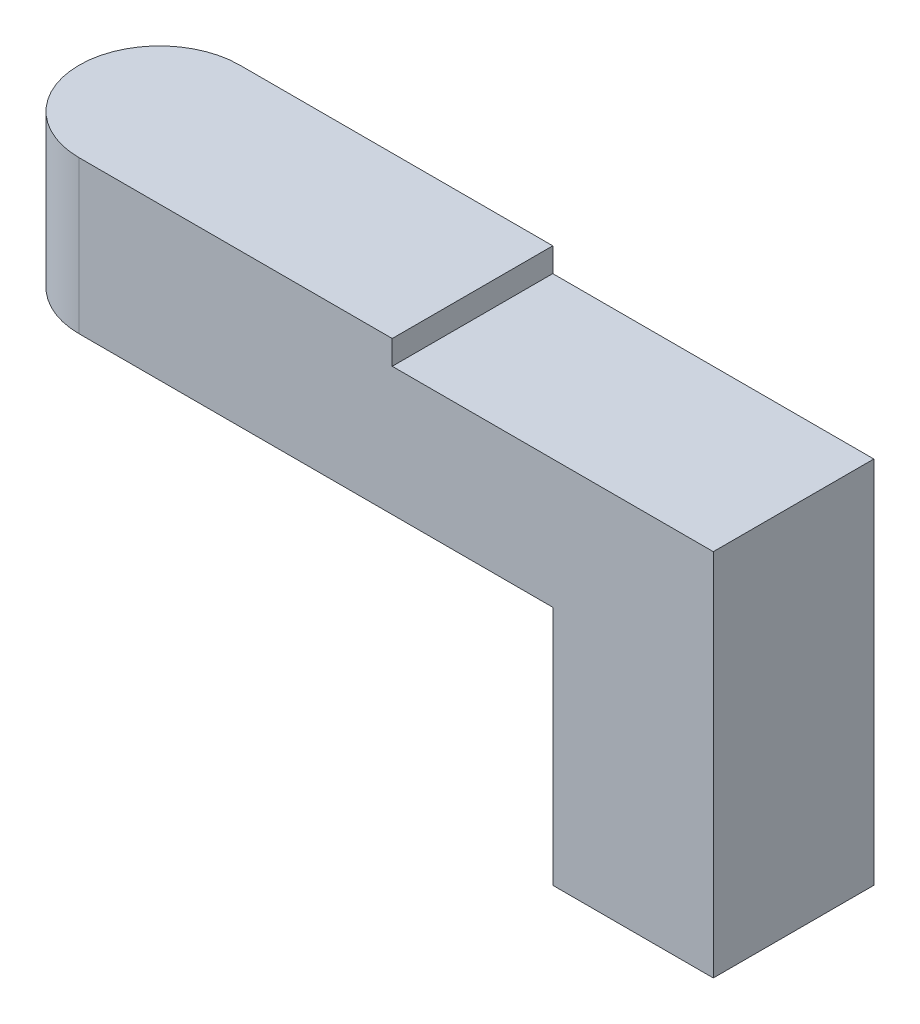
ISO-10303-21;
HEADER;
FILE_DESCRIPTION(('STEP AP214'),'2;1');
FILE_NAME('part.step','',(''),(''),'','','');
FILE_SCHEMA(('AUTOMOTIVE_DESIGN { 1 0 10303 214 1 1 1 1 }'));
ENDSEC;
DATA;
#1=APPLICATION_CONTEXT('core data for automotive mechanical design processes');
#2=APPLICATION_PROTOCOL_DEFINITION('international standard','automotive_design',2000,#1);
#3=PRODUCT_CONTEXT('',#1,'mechanical');
#4=PRODUCT('Part','Part','',(#3));
#5=PRODUCT_RELATED_PRODUCT_CATEGORY('part','',(#4));
#6=PRODUCT_DEFINITION_FORMATION('','',#4);
#7=PRODUCT_DEFINITION_CONTEXT('part definition',#1,'design');
#8=PRODUCT_DEFINITION('design','',#6,#7);
#9=PRODUCT_DEFINITION_SHAPE('','',#8);
#10=(LENGTH_UNIT() NAMED_UNIT(*) SI_UNIT(.MILLI.,.METRE.));
#11=(NAMED_UNIT(*) PLANE_ANGLE_UNIT() SI_UNIT($,.RADIAN.));
#12=(NAMED_UNIT(*) SI_UNIT($,.STERADIAN.) SOLID_ANGLE_UNIT());
#13=UNCERTAINTY_MEASURE_WITH_UNIT(LENGTH_MEASURE(1.E-05),#10,'distance_accuracy_value','');
#14=(GEOMETRIC_REPRESENTATION_CONTEXT(3) GLOBAL_UNCERTAINTY_ASSIGNED_CONTEXT((#13)) GLOBAL_UNIT_ASSIGNED_CONTEXT((#10,
#11,#12)) REPRESENTATION_CONTEXT('',''));
#15=CARTESIAN_POINT('',(0.,0.,0.));
#16=DIRECTION('',(0.,0.,1.));
#17=DIRECTION('',(1.,0.,0.));
#18=AXIS2_PLACEMENT_3D('',#15,#16,#17);
#19=CARTESIAN_POINT('',(34.5,10.,0.));
#20=DIRECTION('',(0.,0.,1.));
#21=DIRECTION('',(-1.,0.,0.));
#22=AXIS2_PLACEMENT_3D('',#19,#20,#21);
#23=PLANE('',#22);
#24=CARTESIAN_POINT('',(39.5,-10.,0.));
#25=DIRECTION('',(0.,0.,1.));
#26=DIRECTION('',(1.,0.,0.));
#27=AXIS2_PLACEMENT_3D('',#24,#25,#26);
#28=CIRCLE('',#27,2.);
#29=CARTESIAN_POINT('',(41.5,-10.,0.));
#30=VERTEX_POINT('',#29);
#31=EDGE_CURVE('E126',#30,#30,#28,.T.);
#32=ORIENTED_EDGE('',*,*,#31,.T.);
#33=EDGE_LOOP('',(#32));
#34=FACE_BOUND('',#33,.T.);
#35=CARTESIAN_POINT('',(39.5,3.,0.));
#36=DIRECTION('',(0.,0.,1.));
#37=DIRECTION('',(1.,0.,0.));
#38=AXIS2_PLACEMENT_3D('',#35,#36,#37);
#39=CIRCLE('',#38,2.);
#40=CARTESIAN_POINT('',(41.5,3.,0.));
#41=VERTEX_POINT('',#40);
#42=EDGE_CURVE('E133',#41,#41,#39,.T.);
#43=ORIENTED_EDGE('',*,*,#42,.T.);
#44=EDGE_LOOP('',(#43));
#45=FACE_BOUND('',#44,.T.);
#46=DIRECTION('',(1.,0.,0.));
#47=VECTOR('',#46,1.);
#48=CARTESIAN_POINT('',(5.,9.5,0.));
#49=LINE('',#48,#47);
#50=CARTESIAN_POINT('',(5.,9.5,0.));
#51=VERTEX_POINT('',#50);
#52=CARTESIAN_POINT('',(24.5,9.5,0.));
#53=VERTEX_POINT('',#52);
#54=EDGE_CURVE('E119',#51,#53,#49,.T.);
#55=ORIENTED_EDGE('',*,*,#54,.T.);
#56=DIRECTION('',(0.,1.,0.));
#57=VECTOR('',#56,1.);
#58=CARTESIAN_POINT('',(24.5,10.,0.));
#59=LINE('',#58,#57);
#60=CARTESIAN_POINT('',(24.5,8.,0.));
#61=VERTEX_POINT('',#60);
#62=EDGE_CURVE('E172',#61,#53,#59,.T.);
#63=ORIENTED_EDGE('',*,*,#62,.F.);
#64=DIRECTION('',(-1.,0.,0.));
#65=VECTOR('',#64,1.);
#66=CARTESIAN_POINT('',(34.5,8.,0.));
#67=LINE('',#66,#65);
#68=CARTESIAN_POINT('',(44.5,8.,0.));
#69=VERTEX_POINT('',#68);
#70=EDGE_CURVE('E174',#69,#61,#67,.T.);
#71=ORIENTED_EDGE('',*,*,#70,.F.);
#72=DIRECTION('',(0.,-1.,0.));
#73=VECTOR('',#72,1.);
#74=CARTESIAN_POINT('',(44.5,10.,0.));
#75=LINE('',#74,#73);
#76=CARTESIAN_POINT('',(44.5,-15.,0.));
#77=VERTEX_POINT('',#76);
#78=EDGE_CURVE('E184',#69,#77,#75,.T.);
#79=ORIENTED_EDGE('',*,*,#78,.T.);
#80=DIRECTION('',(-1.,0.,0.));
#81=VECTOR('',#80,1.);
#82=CARTESIAN_POINT('',(34.5,-15.,0.));
#83=LINE('',#82,#81);
#84=CARTESIAN_POINT('',(34.5,-15.,0.));
#85=VERTEX_POINT('',#84);
#86=EDGE_CURVE('E148',#77,#85,#83,.T.);
#87=ORIENTED_EDGE('',*,*,#86,.T.);
#88=DIRECTION('',(0.,1.,0.));
#89=VECTOR('',#88,1.);
#90=CARTESIAN_POINT('',(34.5,-15.,0.));
#91=LINE('',#90,#89);
#92=CARTESIAN_POINT('',(34.5,0.,0.));
#93=VERTEX_POINT('',#92);
#94=EDGE_CURVE('E151',#85,#93,#91,.T.);
#95=ORIENTED_EDGE('',*,*,#94,.T.);
#96=DIRECTION('',(1.,0.,0.));
#97=VECTOR('',#96,1.);
#98=CARTESIAN_POINT('',(34.5,0.,0.));
#99=LINE('',#98,#97);
#100=CARTESIAN_POINT('',(5.,0.,0.));
#101=VERTEX_POINT('',#100);
#102=EDGE_CURVE('E121',#101,#93,#99,.T.);
#103=ORIENTED_EDGE('',*,*,#102,.F.);
#104=DIRECTION('',(0.,-1.,0.));
#105=VECTOR('',#104,1.);
#106=CARTESIAN_POINT('',(5.,10.,0.));
#107=LINE('',#106,#105);
#108=EDGE_CURVE('E11',#51,#101,#107,.T.);
#109=ORIENTED_EDGE('',*,*,#108,.F.);
#110=EDGE_LOOP('',(#55,#63,#71,#79,#87,#95,#103,#109));
#111=FACE_BOUND('',#110,.T.);
#112=ADVANCED_FACE('F35',(#34,#45,#111),#23,.F.);
#113=CARTESIAN_POINT('',(0.,10.,10.));
#114=DIRECTION('',(0.,0.,-1.));
#115=DIRECTION('',(1.,0.,0.));
#116=AXIS2_PLACEMENT_3D('',#113,#114,#115);
#117=PLANE('',#116);
#118=DIRECTION('',(-1.,0.,0.));
#119=VECTOR('',#118,1.);
#120=CARTESIAN_POINT('',(24.5,9.5,10.));
#121=LINE('',#120,#119);
#122=CARTESIAN_POINT('',(24.5,9.5,10.));
#123=VERTEX_POINT('',#122);
#124=CARTESIAN_POINT('',(5.,9.5,10.));
#125=VERTEX_POINT('',#124);
#126=EDGE_CURVE('E114',#123,#125,#121,.T.);
#127=ORIENTED_EDGE('',*,*,#126,.T.);
#128=DIRECTION('',(0.,-1.,0.));
#129=VECTOR('',#128,1.);
#130=CARTESIAN_POINT('',(5.,10.,10.));
#131=LINE('',#130,#129);
#132=CARTESIAN_POINT('',(5.,0.,10.));
#133=VERTEX_POINT('',#132);
#134=EDGE_CURVE('E44',#133,#125,#131,.F.);
#135=ORIENTED_EDGE('',*,*,#134,.F.);
#136=DIRECTION('',(-1.,0.,0.));
#137=VECTOR('',#136,1.);
#138=CARTESIAN_POINT('',(0.,0.,10.));
#139=LINE('',#138,#137);
#140=CARTESIAN_POINT('',(34.5,0.,10.));
#141=VERTEX_POINT('',#140);
#142=EDGE_CURVE('E178',#141,#133,#139,.T.);
#143=ORIENTED_EDGE('',*,*,#142,.F.);
#144=DIRECTION('',(0.,1.,0.));
#145=VECTOR('',#144,1.);
#146=CARTESIAN_POINT('',(34.5,-15.,10.));
#147=LINE('',#146,#145);
#148=CARTESIAN_POINT('',(34.5,-15.,10.));
#149=VERTEX_POINT('',#148);
#150=EDGE_CURVE('E154',#149,#141,#147,.T.);
#151=ORIENTED_EDGE('',*,*,#150,.F.);
#152=DIRECTION('',(1.,0.,0.));
#153=VECTOR('',#152,1.);
#154=CARTESIAN_POINT('',(34.5,-15.,10.));
#155=LINE('',#154,#153);
#156=CARTESIAN_POINT('',(44.5,-15.,10.));
#157=VERTEX_POINT('',#156);
#158=EDGE_CURVE('E143',#149,#157,#155,.T.);
#159=ORIENTED_EDGE('',*,*,#158,.T.);
#160=DIRECTION('',(0.,-1.,0.));
#161=VECTOR('',#160,1.);
#162=CARTESIAN_POINT('',(44.5,10.,10.));
#163=LINE('',#162,#161);
#164=CARTESIAN_POINT('',(44.5,8.,10.));
#165=VERTEX_POINT('',#164);
#166=EDGE_CURVE('E181',#165,#157,#163,.T.);
#167=ORIENTED_EDGE('',*,*,#166,.F.);
#168=DIRECTION('',(-1.,0.,0.));
#169=VECTOR('',#168,1.);
#170=CARTESIAN_POINT('',(44.5,8.,10.));
#171=LINE('',#170,#169);
#172=CARTESIAN_POINT('',(24.5,8.,10.));
#173=VERTEX_POINT('',#172);
#174=EDGE_CURVE('E164',#165,#173,#171,.T.);
#175=ORIENTED_EDGE('',*,*,#174,.T.);
#176=DIRECTION('',(0.,1.,0.));
#177=VECTOR('',#176,1.);
#178=CARTESIAN_POINT('',(24.5,8.,10.));
#179=LINE('',#178,#177);
#180=EDGE_CURVE('E169',#173,#123,#179,.T.);
#181=ORIENTED_EDGE('',*,*,#180,.T.);
#182=EDGE_LOOP('',(#127,#135,#143,#151,#159,#167,#175,#181));
#183=FACE_BOUND('',#182,.T.);
#184=ADVANCED_FACE('F197',(#183),#117,.F.);
#185=CARTESIAN_POINT('',(24.5,8.,10.));
#186=DIRECTION('',(-1.,0.,0.));
#187=DIRECTION('',(0.,0.,-1.));
#188=AXIS2_PLACEMENT_3D('',#185,#186,#187);
#189=PLANE('',#188);
#190=DIRECTION('',(0.,0.,1.));
#191=VECTOR('',#190,1.);
#192=CARTESIAN_POINT('',(24.5,9.5,0.));
#193=LINE('',#192,#191);
#194=EDGE_CURVE('E123',#53,#123,#193,.T.);
#195=ORIENTED_EDGE('',*,*,#194,.T.);
#196=ORIENTED_EDGE('',*,*,#180,.F.);
#197=DIRECTION('',(0.,0.,-1.));
#198=VECTOR('',#197,1.);
#199=CARTESIAN_POINT('',(24.5,8.,10.));
#200=LINE('',#199,#198);
#201=EDGE_CURVE('E167',#173,#61,#200,.T.);
#202=ORIENTED_EDGE('',*,*,#201,.T.);
#203=ORIENTED_EDGE('',*,*,#62,.T.);
#204=EDGE_LOOP('',(#195,#196,#202,#203));
#205=FACE_BOUND('',#204,.T.);
#206=ADVANCED_FACE('F202',(#205),#189,.F.);
#207=CARTESIAN_POINT('',(5.,10.,5.));
#208=DIRECTION('',(0.,-1.,0.));
#209=DIRECTION('',(0.,0.,1.));
#210=AXIS2_PLACEMENT_3D('',#207,#208,#209);
#211=CYLINDRICAL_SURFACE('',#210,5.);
#212=ORIENTED_EDGE('',*,*,#108,.T.);
#213=CARTESIAN_POINT('',(5.,0.,5.));
#214=DIRECTION('',(0.,1.,0.));
#215=DIRECTION('',(0.,0.,1.));
#216=AXIS2_PLACEMENT_3D('',#213,#214,#215);
#217=CIRCLE('',#216,5.);
#218=CARTESIAN_POINT('',(0.,0.,5.));
#219=VERTEX_POINT('',#218);
#220=EDGE_CURVE('E187',#101,#219,#217,.T.);
#221=ORIENTED_EDGE('',*,*,#220,.T.);
#222=DIRECTION('',(0.,-1.,0.));
#223=VECTOR('',#222,1.);
#224=CARTESIAN_POINT('',(0.,10.,5.));
#225=LINE('',#224,#223);
#226=CARTESIAN_POINT('',(0.,9.5,5.));
#227=VERTEX_POINT('',#226);
#228=EDGE_CURVE('E39',#219,#227,#225,.F.);
#229=ORIENTED_EDGE('',*,*,#228,.T.);
#230=CARTESIAN_POINT('',(5.,9.5,5.));
#231=DIRECTION('',(0.,-1.,0.));
#232=DIRECTION('',(0.,0.,-1.));
#233=AXIS2_PLACEMENT_3D('',#230,#231,#232);
#234=CIRCLE('',#233,5.);
#235=EDGE_CURVE('E108',#227,#51,#234,.T.);
#236=ORIENTED_EDGE('',*,*,#235,.T.);
#237=EDGE_LOOP('',(#212,#221,#229,#236));
#238=FACE_BOUND('',#237,.T.);
#239=ADVANCED_FACE('F37',(#238),#211,.T.);
#240=CARTESIAN_POINT('',(5.,10.,5.));
#241=DIRECTION('',(0.,-1.,0.));
#242=DIRECTION('',(0.,0.,1.));
#243=AXIS2_PLACEMENT_3D('',#240,#241,#242);
#244=CYLINDRICAL_SURFACE('',#243,5.);
#245=ORIENTED_EDGE('',*,*,#228,.F.);
#246=CARTESIAN_POINT('',(5.,0.,5.));
#247=DIRECTION('',(0.,1.,0.));
#248=DIRECTION('',(0.,0.,1.));
#249=AXIS2_PLACEMENT_3D('',#246,#247,#248);
#250=CIRCLE('',#249,5.);
#251=EDGE_CURVE('E189',#219,#133,#250,.T.);
#252=ORIENTED_EDGE('',*,*,#251,.T.);
#253=ORIENTED_EDGE('',*,*,#134,.T.);
#254=EDGE_CURVE('E51',#125,#227,#234,.T.);
#255=ORIENTED_EDGE('',*,*,#254,.T.);
#256=EDGE_LOOP('',(#245,#252,#253,#255));
#257=FACE_BOUND('',#256,.T.);
#258=ADVANCED_FACE('F194',(#257),#244,.T.);
#259=CARTESIAN_POINT('',(44.5,10.,0.));
#260=DIRECTION('',(-1.,0.,0.));
#261=DIRECTION('',(0.,0.,-1.));
#262=AXIS2_PLACEMENT_3D('',#259,#260,#261);
#263=PLANE('',#262);
#264=ORIENTED_EDGE('',*,*,#166,.T.);
#265=DIRECTION('',(0.,0.,-1.));
#266=VECTOR('',#265,1.);
#267=CARTESIAN_POINT('',(44.5,-15.,0.));
#268=LINE('',#267,#266);
#269=EDGE_CURVE('E146',#157,#77,#268,.T.);
#270=ORIENTED_EDGE('',*,*,#269,.T.);
#271=ORIENTED_EDGE('',*,*,#78,.F.);
#272=DIRECTION('',(0.,0.,1.));
#273=VECTOR('',#272,1.);
#274=CARTESIAN_POINT('',(44.5,8.,10.));
#275=LINE('',#274,#273);
#276=EDGE_CURVE('E162',#69,#165,#275,.T.);
#277=ORIENTED_EDGE('',*,*,#276,.T.);
#278=EDGE_LOOP('',(#264,#270,#271,#277));
#279=FACE_BOUND('',#278,.T.);
#280=ADVANCED_FACE('F208',(#279),#263,.F.);
#281=CARTESIAN_POINT('',(0.,0.,0.));
#282=DIRECTION('',(0.,-1.,0.));
#283=DIRECTION('',(0.,0.,1.));
#284=AXIS2_PLACEMENT_3D('',#281,#282,#283);
#285=PLANE('',#284);
#286=DIRECTION('',(0.,0.,1.));
#287=VECTOR('',#286,1.);
#288=CARTESIAN_POINT('',(34.5,0.,0.));
#289=LINE('',#288,#287);
#290=EDGE_CURVE('E59',#93,#141,#289,.T.);
#291=ORIENTED_EDGE('',*,*,#290,.T.);
#292=ORIENTED_EDGE('',*,*,#142,.T.);
#293=ORIENTED_EDGE('',*,*,#251,.F.);
#294=ORIENTED_EDGE('',*,*,#220,.F.);
#295=ORIENTED_EDGE('',*,*,#102,.T.);
#296=EDGE_LOOP('',(#291,#292,#293,#294,#295));
#297=FACE_BOUND('',#296,.T.);
#298=CARTESIAN_POINT('',(6.5,0.,5.));
#299=DIRECTION('',(0.,1.,0.));
#300=DIRECTION('',(0.,0.,1.));
#301=AXIS2_PLACEMENT_3D('',#298,#299,#300);
#302=CIRCLE('',#301,2.5);
#303=CARTESIAN_POINT('',(6.5,0.,7.5));
#304=VERTEX_POINT('',#303);
#305=EDGE_CURVE('E156',#304,#304,#302,.T.);
#306=ORIENTED_EDGE('',*,*,#305,.T.);
#307=EDGE_LOOP('',(#306));
#308=FACE_BOUND('',#307,.T.);
#309=ADVANCED_FACE('F216',(#297,#308),#285,.T.);
#310=CARTESIAN_POINT('',(0.,8.,0.));
#311=DIRECTION('',(0.,-1.,0.));
#312=DIRECTION('',(0.,0.,1.));
#313=AXIS2_PLACEMENT_3D('',#310,#311,#312);
#314=PLANE('',#313);
#315=ORIENTED_EDGE('',*,*,#276,.F.);
#316=ORIENTED_EDGE('',*,*,#70,.T.);
#317=ORIENTED_EDGE('',*,*,#201,.F.);
#318=ORIENTED_EDGE('',*,*,#174,.F.);
#319=EDGE_LOOP('',(#315,#316,#317,#318));
#320=FACE_BOUND('',#319,.T.);
#321=ADVANCED_FACE('F206',(#320),#314,.F.);
#322=CARTESIAN_POINT('',(6.5,5.,5.));
#323=DIRECTION('',(0.,-1.,0.));
#324=DIRECTION('',(0.,0.,1.));
#325=AXIS2_PLACEMENT_3D('',#322,#323,#324);
#326=CYLINDRICAL_SURFACE('',#325,2.5);
#327=CARTESIAN_POINT('',(6.5,5.,5.));
#328=DIRECTION('',(0.,1.,0.));
#329=DIRECTION('',(0.,0.,1.));
#330=AXIS2_PLACEMENT_3D('',#327,#328,#329);
#331=CIRCLE('',#330,2.5);
#332=CARTESIAN_POINT('',(6.5,5.,7.5));
#333=VERTEX_POINT('',#332);
#334=EDGE_CURVE('E157',#333,#333,#331,.T.);
#335=ORIENTED_EDGE('',*,*,#334,.T.);
#336=EDGE_LOOP('',(#335));
#337=FACE_BOUND('',#336,.T.);
#338=ORIENTED_EDGE('',*,*,#305,.F.);
#339=EDGE_LOOP('',(#338));
#340=FACE_BOUND('',#339,.T.);
#341=ADVANCED_FACE('F222',(#337,#340),#326,.F.);
#342=CARTESIAN_POINT('',(6.5,5.,5.));
#343=DIRECTION('',(0.,-1.,0.));
#344=DIRECTION('',(0.,0.,1.));
#345=AXIS2_PLACEMENT_3D('',#342,#343,#344);
#346=PLANE('',#345);
#347=ORIENTED_EDGE('',*,*,#334,.F.);
#348=EDGE_LOOP('',(#347));
#349=FACE_BOUND('',#348,.T.);
#350=ADVANCED_FACE('F224',(#349),#346,.T.);
#351=CARTESIAN_POINT('',(34.5,-15.,0.));
#352=DIRECTION('',(1.,0.,0.));
#353=DIRECTION('',(0.,0.,1.));
#354=AXIS2_PLACEMENT_3D('',#351,#352,#353);
#355=PLANE('',#354);
#356=ORIENTED_EDGE('',*,*,#290,.F.);
#357=ORIENTED_EDGE('',*,*,#94,.F.);
#358=DIRECTION('',(0.,0.,1.));
#359=VECTOR('',#358,1.);
#360=CARTESIAN_POINT('',(34.5,-15.,0.));
#361=LINE('',#360,#359);
#362=EDGE_CURVE('E141',#85,#149,#361,.T.);
#363=ORIENTED_EDGE('',*,*,#362,.T.);
#364=ORIENTED_EDGE('',*,*,#150,.T.);
#365=EDGE_LOOP('',(#356,#357,#363,#364));
#366=FACE_BOUND('',#365,.T.);
#367=ADVANCED_FACE('F213',(#366),#355,.F.);
#368=CARTESIAN_POINT('',(0.,-15.,0.));
#369=DIRECTION('',(0.,-1.,0.));
#370=DIRECTION('',(0.,0.,1.));
#371=AXIS2_PLACEMENT_3D('',#368,#369,#370);
#372=PLANE('',#371);
#373=ORIENTED_EDGE('',*,*,#362,.F.);
#374=ORIENTED_EDGE('',*,*,#86,.F.);
#375=ORIENTED_EDGE('',*,*,#269,.F.);
#376=ORIENTED_EDGE('',*,*,#158,.F.);
#377=EDGE_LOOP('',(#373,#374,#375,#376));
#378=FACE_BOUND('',#377,.T.);
#379=ADVANCED_FACE('F212',(#378),#372,.T.);
#380=CARTESIAN_POINT('',(39.5,-10.,7.));
#381=DIRECTION('',(0.,0.,-1.));
#382=DIRECTION('',(1.,0.,0.));
#383=AXIS2_PLACEMENT_3D('',#380,#381,#382);
#384=CYLINDRICAL_SURFACE('',#383,2.);
#385=CARTESIAN_POINT('',(39.5,-10.,7.));
#386=DIRECTION('',(0.,0.,1.));
#387=DIRECTION('',(1.,0.,0.));
#388=AXIS2_PLACEMENT_3D('',#385,#386,#387);
#389=CIRCLE('',#388,2.);
#390=CARTESIAN_POINT('',(41.5,-10.,7.));
#391=VERTEX_POINT('',#390);
#392=EDGE_CURVE('E136',#391,#391,#389,.T.);
#393=ORIENTED_EDGE('',*,*,#392,.T.);
#394=EDGE_LOOP('',(#393));
#395=FACE_BOUND('',#394,.T.);
#396=ORIENTED_EDGE('',*,*,#31,.F.);
#397=EDGE_LOOP('',(#396));
#398=FACE_BOUND('',#397,.T.);
#399=ADVANCED_FACE('F325',(#395,#398),#384,.F.);
#400=CARTESIAN_POINT('',(39.5,-10.,7.));
#401=DIRECTION('',(0.,0.,-1.));
#402=DIRECTION('',(1.,0.,0.));
#403=AXIS2_PLACEMENT_3D('',#400,#401,#402);
#404=PLANE('',#403);
#405=ORIENTED_EDGE('',*,*,#392,.F.);
#406=EDGE_LOOP('',(#405));
#407=FACE_BOUND('',#406,.T.);
#408=ADVANCED_FACE('F333',(#407),#404,.T.);
#409=CARTESIAN_POINT('',(39.5,3.,7.));
#410=DIRECTION('',(0.,0.,-1.));
#411=DIRECTION('',(1.,0.,0.));
#412=AXIS2_PLACEMENT_3D('',#409,#410,#411);
#413=CYLINDRICAL_SURFACE('',#412,2.);
#414=CARTESIAN_POINT('',(39.5,3.,7.));
#415=DIRECTION('',(0.,0.,1.));
#416=DIRECTION('',(1.,0.,0.));
#417=AXIS2_PLACEMENT_3D('',#414,#415,#416);
#418=CIRCLE('',#417,2.);
#419=CARTESIAN_POINT('',(41.5,3.,7.));
#420=VERTEX_POINT('',#419);
#421=EDGE_CURVE('E130',#420,#420,#418,.T.);
#422=ORIENTED_EDGE('',*,*,#421,.T.);
#423=EDGE_LOOP('',(#422));
#424=FACE_BOUND('',#423,.T.);
#425=ORIENTED_EDGE('',*,*,#42,.F.);
#426=EDGE_LOOP('',(#425));
#427=FACE_BOUND('',#426,.T.);
#428=ADVANCED_FACE('F342',(#424,#427),#413,.F.);
#429=CARTESIAN_POINT('',(39.5,3.,7.));
#430=DIRECTION('',(0.,0.,-1.));
#431=DIRECTION('',(1.,0.,0.));
#432=AXIS2_PLACEMENT_3D('',#429,#430,#431);
#433=PLANE('',#432);
#434=ORIENTED_EDGE('',*,*,#421,.F.);
#435=EDGE_LOOP('',(#434));
#436=FACE_BOUND('',#435,.T.);
#437=ADVANCED_FACE('F351',(#436),#433,.T.);
#438=CARTESIAN_POINT('',(5.,9.5,5.));
#439=DIRECTION('',(0.,1.,0.));
#440=DIRECTION('',(0.,0.,-1.));
#441=AXIS2_PLACEMENT_3D('',#438,#439,#440);
#442=PLANE('',#441);
#443=ORIENTED_EDGE('',*,*,#126,.F.);
#444=ORIENTED_EDGE('',*,*,#194,.F.);
#445=ORIENTED_EDGE('',*,*,#54,.F.);
#446=ORIENTED_EDGE('',*,*,#235,.F.);
#447=ORIENTED_EDGE('',*,*,#254,.F.);
#448=EDGE_LOOP('',(#443,#444,#445,#446,#447));
#449=FACE_BOUND('',#448,.T.);
#450=ADVANCED_FACE('F122',(#449),#442,.T.);
#451=CLOSED_SHELL('',(#112,#184,#206,#239,#258,#280,#309,#321,#341,#350,#367,#379,#399,#408,
#428,#437,#450));
#452=MANIFOLD_SOLID_BREP('B2',#451);
#453=ADVANCED_BREP_SHAPE_REPRESENTATION('',(#18,#452),#14);
#454=SHAPE_DEFINITION_REPRESENTATION(#9,#453);
ENDSEC;
END-ISO-10303-21;
